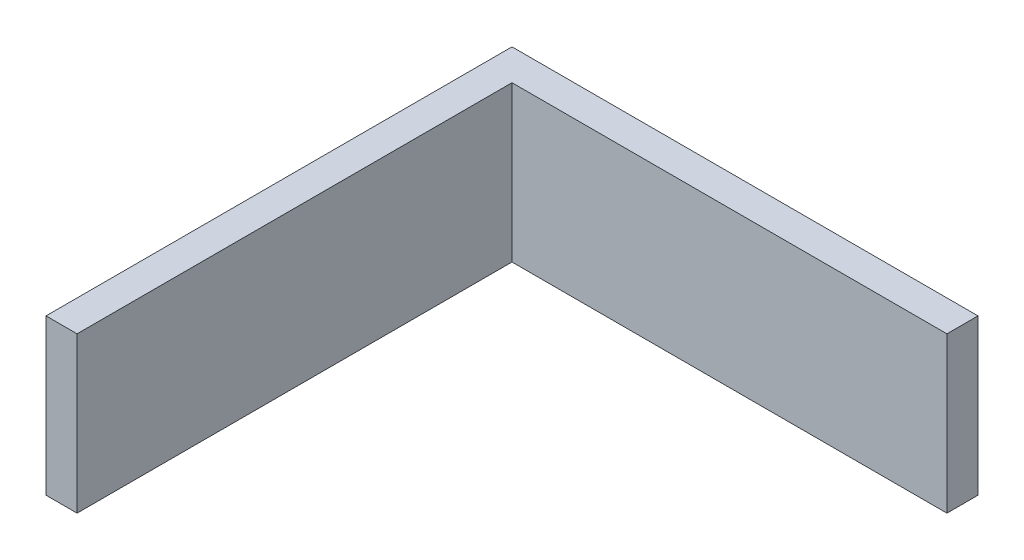
ISO-10303-21;
HEADER;
FILE_DESCRIPTION(('STEP AP214'),'2;1');
FILE_NAME('part.step','',(''),(''),'','','');
FILE_SCHEMA(('AUTOMOTIVE_DESIGN { 1 0 10303 214 1 1 1 1 }'));
ENDSEC;
DATA;
#1=APPLICATION_CONTEXT('core data for automotive mechanical design processes');
#2=APPLICATION_PROTOCOL_DEFINITION('international standard','automotive_design',2000,#1);
#3=PRODUCT_CONTEXT('',#1,'mechanical');
#4=PRODUCT('Part','Part','',(#3));
#5=PRODUCT_RELATED_PRODUCT_CATEGORY('part','',(#4));
#6=PRODUCT_DEFINITION_FORMATION('','',#4);
#7=PRODUCT_DEFINITION_CONTEXT('part definition',#1,'design');
#8=PRODUCT_DEFINITION('design','',#6,#7);
#9=PRODUCT_DEFINITION_SHAPE('','',#8);
#10=(LENGTH_UNIT() NAMED_UNIT(*) SI_UNIT(.MILLI.,.METRE.));
#11=(NAMED_UNIT(*) PLANE_ANGLE_UNIT() SI_UNIT($,.RADIAN.));
#12=(NAMED_UNIT(*) SI_UNIT($,.STERADIAN.) SOLID_ANGLE_UNIT());
#13=UNCERTAINTY_MEASURE_WITH_UNIT(LENGTH_MEASURE(1.E-05),#10,'distance_accuracy_value','');
#14=(GEOMETRIC_REPRESENTATION_CONTEXT(3) GLOBAL_UNCERTAINTY_ASSIGNED_CONTEXT((#13)) GLOBAL_UNIT_ASSIGNED_CONTEXT((#10,
#11,#12)) REPRESENTATION_CONTEXT('',''));
#15=CARTESIAN_POINT('',(0.,0.,0.));
#16=DIRECTION('',(0.,0.,1.));
#17=DIRECTION('',(1.,0.,0.));
#18=AXIS2_PLACEMENT_3D('',#15,#16,#17);
#19=CARTESIAN_POINT('',(0.,10.,0.));
#20=DIRECTION('',(0.,0.,1.));
#21=DIRECTION('',(1.,0.,0.));
#22=AXIS2_PLACEMENT_3D('',#19,#20,#21);
#23=PLANE('',#22);
#24=DIRECTION('',(-1.,0.,0.));
#25=VECTOR('',#24,1.);
#26=CARTESIAN_POINT('',(0.,0.,0.));
#27=LINE('',#26,#25);
#28=CARTESIAN_POINT('',(28.,0.,0.));
#29=VERTEX_POINT('',#28);
#30=CARTESIAN_POINT('',(-2.,0.,0.));
#31=VERTEX_POINT('',#30);
#32=EDGE_CURVE('E136',#29,#31,#27,.T.);
#33=ORIENTED_EDGE('',*,*,#32,.T.);
#34=DIRECTION('',(0.,-1.,0.));
#35=VECTOR('',#34,1.);
#36=CARTESIAN_POINT('',(-2.,10.,0.));
#37=LINE('',#36,#35);
#38=CARTESIAN_POINT('',(-2.,10.,0.));
#39=VERTEX_POINT('',#38);
#40=EDGE_CURVE('E11',#39,#31,#37,.T.);
#41=ORIENTED_EDGE('',*,*,#40,.F.);
#42=DIRECTION('',(-1.,0.,0.));
#43=VECTOR('',#42,1.);
#44=CARTESIAN_POINT('',(0.,10.,0.));
#45=LINE('',#44,#43);
#46=CARTESIAN_POINT('',(28.,10.,0.));
#47=VERTEX_POINT('',#46);
#48=EDGE_CURVE('E156',#47,#39,#45,.T.);
#49=ORIENTED_EDGE('',*,*,#48,.F.);
#50=DIRECTION('',(0.,-1.,0.));
#51=VECTOR('',#50,1.);
#52=CARTESIAN_POINT('',(28.,10.,0.));
#53=LINE('',#52,#51);
#54=EDGE_CURVE('E62',#47,#29,#53,.T.);
#55=ORIENTED_EDGE('',*,*,#54,.T.);
#56=EDGE_LOOP('',(#33,#41,#49,#55));
#57=FACE_BOUND('',#56,.T.);
#58=ADVANCED_FACE('F45',(#57),#23,.F.);
#59=CARTESIAN_POINT('',(-2.,10.,0.));
#60=DIRECTION('',(1.,0.,0.));
#61=DIRECTION('',(0.,0.,-1.));
#62=AXIS2_PLACEMENT_3D('',#59,#60,#61);
#63=PLANE('',#62);
#64=DIRECTION('',(0.,0.,1.));
#65=VECTOR('',#64,1.);
#66=CARTESIAN_POINT('',(-2.,0.,0.));
#67=LINE('',#66,#65);
#68=CARTESIAN_POINT('',(-2.,0.,30.));
#69=VERTEX_POINT('',#68);
#70=EDGE_CURVE('E139',#31,#69,#67,.T.);
#71=ORIENTED_EDGE('',*,*,#70,.T.);
#72=DIRECTION('',(0.,-1.,0.));
#73=VECTOR('',#72,1.);
#74=CARTESIAN_POINT('',(-2.,10.,30.));
#75=LINE('',#74,#73);
#76=CARTESIAN_POINT('',(-2.,10.,30.));
#77=VERTEX_POINT('',#76);
#78=EDGE_CURVE('E54',#77,#69,#75,.T.);
#79=ORIENTED_EDGE('',*,*,#78,.F.);
#80=DIRECTION('',(0.,0.,1.));
#81=VECTOR('',#80,1.);
#82=CARTESIAN_POINT('',(-2.,10.,0.));
#83=LINE('',#82,#81);
#84=EDGE_CURVE('E95',#39,#77,#83,.T.);
#85=ORIENTED_EDGE('',*,*,#84,.F.);
#86=ORIENTED_EDGE('',*,*,#40,.T.);
#87=EDGE_LOOP('',(#71,#79,#85,#86));
#88=FACE_BOUND('',#87,.T.);
#89=ADVANCED_FACE('F166',(#88),#63,.F.);
#90=CARTESIAN_POINT('',(0.,10.,30.));
#91=DIRECTION('',(0.,0.,1.));
#92=DIRECTION('',(1.,0.,0.));
#93=AXIS2_PLACEMENT_3D('',#90,#91,#92);
#94=PLANE('',#93);
#95=DIRECTION('',(-1.,0.,0.));
#96=VECTOR('',#95,1.);
#97=CARTESIAN_POINT('',(0.,0.,30.));
#98=LINE('',#97,#96);
#99=CARTESIAN_POINT('',(0.,0.,30.));
#100=VERTEX_POINT('',#99);
#101=EDGE_CURVE('E143',#100,#69,#98,.T.);
#102=ORIENTED_EDGE('',*,*,#101,.F.);
#103=DIRECTION('',(0.,-1.,0.));
#104=VECTOR('',#103,1.);
#105=CARTESIAN_POINT('',(0.,10.,30.));
#106=LINE('',#105,#104);
#107=CARTESIAN_POINT('',(0.,10.,30.));
#108=VERTEX_POINT('',#107);
#109=EDGE_CURVE('E115',#108,#100,#106,.T.);
#110=ORIENTED_EDGE('',*,*,#109,.F.);
#111=DIRECTION('',(-1.,0.,0.));
#112=VECTOR('',#111,1.);
#113=CARTESIAN_POINT('',(0.,10.,30.));
#114=LINE('',#113,#112);
#115=EDGE_CURVE('E127',#108,#77,#114,.T.);
#116=ORIENTED_EDGE('',*,*,#115,.T.);
#117=ORIENTED_EDGE('',*,*,#78,.T.);
#118=EDGE_LOOP('',(#102,#110,#116,#117));
#119=FACE_BOUND('',#118,.T.);
#120=ADVANCED_FACE('F165',(#119),#94,.T.);
#121=CARTESIAN_POINT('',(0.,10.,0.));
#122=DIRECTION('',(1.,0.,0.));
#123=DIRECTION('',(0.,0.,-1.));
#124=AXIS2_PLACEMENT_3D('',#121,#122,#123);
#125=PLANE('',#124);
#126=DIRECTION('',(0.,0.,1.));
#127=VECTOR('',#126,1.);
#128=CARTESIAN_POINT('',(0.,0.,0.));
#129=LINE('',#128,#127);
#130=CARTESIAN_POINT('',(0.,0.,2.));
#131=VERTEX_POINT('',#130);
#132=EDGE_CURVE('E111',#131,#100,#129,.T.);
#133=ORIENTED_EDGE('',*,*,#132,.F.);
#134=DIRECTION('',(0.,-1.,0.));
#135=VECTOR('',#134,1.);
#136=CARTESIAN_POINT('',(0.,10.,2.));
#137=LINE('',#136,#135);
#138=CARTESIAN_POINT('',(0.,10.,2.));
#139=VERTEX_POINT('',#138);
#140=EDGE_CURVE('E105',#139,#131,#137,.T.);
#141=ORIENTED_EDGE('',*,*,#140,.F.);
#142=DIRECTION('',(0.,0.,1.));
#143=VECTOR('',#142,1.);
#144=CARTESIAN_POINT('',(0.,10.,0.));
#145=LINE('',#144,#143);
#146=EDGE_CURVE('E109',#139,#108,#145,.T.);
#147=ORIENTED_EDGE('',*,*,#146,.T.);
#148=ORIENTED_EDGE('',*,*,#109,.T.);
#149=EDGE_LOOP('',(#133,#141,#147,#148));
#150=FACE_BOUND('',#149,.T.);
#151=ADVANCED_FACE('F107',(#150),#125,.T.);
#152=CARTESIAN_POINT('',(0.,10.,2.));
#153=DIRECTION('',(0.,0.,-1.));
#154=DIRECTION('',(-1.,0.,0.));
#155=AXIS2_PLACEMENT_3D('',#152,#153,#154);
#156=PLANE('',#155);
#157=DIRECTION('',(1.,0.,0.));
#158=VECTOR('',#157,1.);
#159=CARTESIAN_POINT('',(0.,0.,2.));
#160=LINE('',#159,#158);
#161=CARTESIAN_POINT('',(28.,0.,2.));
#162=VERTEX_POINT('',#161);
#163=EDGE_CURVE('E149',#131,#162,#160,.T.);
#164=ORIENTED_EDGE('',*,*,#163,.T.);
#165=DIRECTION('',(0.,-1.,0.));
#166=VECTOR('',#165,1.);
#167=CARTESIAN_POINT('',(28.,10.,2.));
#168=LINE('',#167,#166);
#169=CARTESIAN_POINT('',(28.,10.,2.));
#170=VERTEX_POINT('',#169);
#171=EDGE_CURVE('E83',#170,#162,#168,.T.);
#172=ORIENTED_EDGE('',*,*,#171,.F.);
#173=DIRECTION('',(1.,0.,0.));
#174=VECTOR('',#173,1.);
#175=CARTESIAN_POINT('',(0.,10.,2.));
#176=LINE('',#175,#174);
#177=EDGE_CURVE('E117',#139,#170,#176,.T.);
#178=ORIENTED_EDGE('',*,*,#177,.F.);
#179=ORIENTED_EDGE('',*,*,#140,.T.);
#180=EDGE_LOOP('',(#164,#172,#178,#179));
#181=FACE_BOUND('',#180,.T.);
#182=ADVANCED_FACE('F118',(#181),#156,.F.);
#183=CARTESIAN_POINT('',(28.,10.,0.));
#184=DIRECTION('',(1.,0.,0.));
#185=DIRECTION('',(0.,0.,-1.));
#186=AXIS2_PLACEMENT_3D('',#183,#184,#185);
#187=PLANE('',#186);
#188=DIRECTION('',(0.,0.,1.));
#189=VECTOR('',#188,1.);
#190=CARTESIAN_POINT('',(28.,0.,0.));
#191=LINE('',#190,#189);
#192=EDGE_CURVE('E152',#29,#162,#191,.T.);
#193=ORIENTED_EDGE('',*,*,#192,.F.);
#194=ORIENTED_EDGE('',*,*,#54,.F.);
#195=DIRECTION('',(0.,0.,1.));
#196=VECTOR('',#195,1.);
#197=CARTESIAN_POINT('',(28.,10.,0.));
#198=LINE('',#197,#196);
#199=EDGE_CURVE('E122',#47,#170,#198,.T.);
#200=ORIENTED_EDGE('',*,*,#199,.T.);
#201=ORIENTED_EDGE('',*,*,#171,.T.);
#202=EDGE_LOOP('',(#193,#194,#200,#201));
#203=FACE_BOUND('',#202,.T.);
#204=ADVANCED_FACE('F170',(#203),#187,.T.);
#205=CARTESIAN_POINT('',(0.,10.,0.));
#206=DIRECTION('',(0.,1.,0.));
#207=DIRECTION('',(0.,0.,1.));
#208=AXIS2_PLACEMENT_3D('',#205,#206,#207);
#209=PLANE('',#208);
#210=ORIENTED_EDGE('',*,*,#48,.T.);
#211=ORIENTED_EDGE('',*,*,#84,.T.);
#212=ORIENTED_EDGE('',*,*,#115,.F.);
#213=ORIENTED_EDGE('',*,*,#146,.F.);
#214=ORIENTED_EDGE('',*,*,#177,.T.);
#215=ORIENTED_EDGE('',*,*,#199,.F.);
#216=EDGE_LOOP('',(#210,#211,#212,#213,#214,#215));
#217=FACE_BOUND('',#216,.T.);
#218=ADVANCED_FACE('F125',(#217),#209,.T.);
#219=CARTESIAN_POINT('',(0.,0.,0.));
#220=DIRECTION('',(0.,1.,0.));
#221=DIRECTION('',(0.,0.,1.));
#222=AXIS2_PLACEMENT_3D('',#219,#220,#221);
#223=PLANE('',#222);
#224=ORIENTED_EDGE('',*,*,#32,.F.);
#225=ORIENTED_EDGE('',*,*,#192,.T.);
#226=ORIENTED_EDGE('',*,*,#163,.F.);
#227=ORIENTED_EDGE('',*,*,#132,.T.);
#228=ORIENTED_EDGE('',*,*,#101,.T.);
#229=ORIENTED_EDGE('',*,*,#70,.F.);
#230=EDGE_LOOP('',(#224,#225,#226,#227,#228,#229));
#231=FACE_BOUND('',#230,.T.);
#232=ADVANCED_FACE('F169',(#231),#223,.F.);
#233=CLOSED_SHELL('',(#58,#89,#120,#151,#182,#204,#218,#232));
#234=MANIFOLD_SOLID_BREP('B2',#233);
#235=ADVANCED_BREP_SHAPE_REPRESENTATION('',(#18,#234),#14);
#236=SHAPE_DEFINITION_REPRESENTATION(#9,#235);
ENDSEC;
END-ISO-10303-21;
